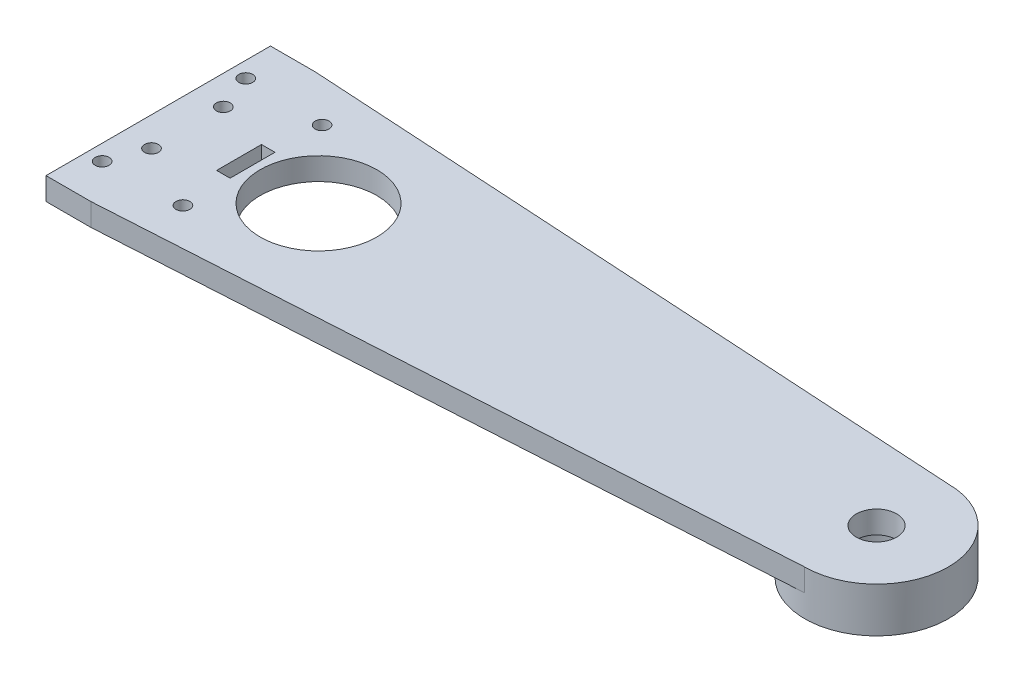
ISO-10303-21;
HEADER;
FILE_DESCRIPTION(('STEP AP214'),'2;1');
FILE_NAME('part.step','',(''),(''),'','','');
FILE_SCHEMA(('AUTOMOTIVE_DESIGN { 1 0 10303 214 1 1 1 1 }'));
ENDSEC;
DATA;
#1=APPLICATION_CONTEXT('core data for automotive mechanical design processes');
#2=APPLICATION_PROTOCOL_DEFINITION('international standard','automotive_design',2000,#1);
#3=PRODUCT_CONTEXT('',#1,'mechanical');
#4=PRODUCT('Part','Part','',(#3));
#5=PRODUCT_RELATED_PRODUCT_CATEGORY('part','',(#4));
#6=PRODUCT_DEFINITION_FORMATION('','',#4);
#7=PRODUCT_DEFINITION_CONTEXT('part definition',#1,'design');
#8=PRODUCT_DEFINITION('design','',#6,#7);
#9=PRODUCT_DEFINITION_SHAPE('','',#8);
#10=(LENGTH_UNIT() NAMED_UNIT(*) SI_UNIT(.MILLI.,.METRE.));
#11=(NAMED_UNIT(*) PLANE_ANGLE_UNIT() SI_UNIT($,.RADIAN.));
#12=(NAMED_UNIT(*) SI_UNIT($,.STERADIAN.) SOLID_ANGLE_UNIT());
#13=UNCERTAINTY_MEASURE_WITH_UNIT(LENGTH_MEASURE(1.E-05),#10,'distance_accuracy_value','');
#14=(GEOMETRIC_REPRESENTATION_CONTEXT(3) GLOBAL_UNCERTAINTY_ASSIGNED_CONTEXT((#13)) GLOBAL_UNIT_ASSIGNED_CONTEXT((#10,
#11,#12)) REPRESENTATION_CONTEXT('',''));
#15=CARTESIAN_POINT('',(0.,0.,0.));
#16=DIRECTION('',(0.,0.,1.));
#17=DIRECTION('',(1.,0.,0.));
#18=AXIS2_PLACEMENT_3D('',#15,#16,#17);
#19=CARTESIAN_POINT('',(113.,-5.,0.));
#20=DIRECTION('',(0.,-1.,0.));
#21=DIRECTION('',(0.,0.,-1.));
#22=AXIS2_PLACEMENT_3D('',#19,#20,#21);
#23=PLANE('',#22);
#24=CARTESIAN_POINT('',(113.,-5.,0.));
#25=DIRECTION('',(0.,-1.,0.));
#26=DIRECTION('',(0.,0.,-1.));
#27=AXIS2_PLACEMENT_3D('',#24,#25,#26);
#28=CIRCLE('',#27,4.5);
#29=CARTESIAN_POINT('',(113.,-5.,-4.5));
#30=VERTEX_POINT('',#29);
#31=EDGE_CURVE('E259',#30,#30,#28,.T.);
#32=ORIENTED_EDGE('',*,*,#31,.F.);
#33=EDGE_LOOP('',(#32));
#34=FACE_BOUND('',#33,.T.);
#35=CARTESIAN_POINT('',(113.,-5.,0.));
#36=DIRECTION('',(0.,-1.,0.));
#37=DIRECTION('',(0.,0.,-1.));
#38=AXIS2_PLACEMENT_3D('',#35,#36,#37);
#39=CIRCLE('',#38,8.2);
#40=CARTESIAN_POINT('',(113.,-5.,-8.2));
#41=VERTEX_POINT('',#40);
#42=EDGE_CURVE('E351',#41,#41,#39,.T.);
#43=ORIENTED_EDGE('',*,*,#42,.T.);
#44=EDGE_LOOP('',(#43));
#45=FACE_BOUND('',#44,.T.);
#46=ADVANCED_FACE('F39',(#34,#45),#23,.T.);
#47=CARTESIAN_POINT('',(113.,-5.,0.));
#48=DIRECTION('',(0.,-1.,0.));
#49=DIRECTION('',(0.,0.,-1.));
#50=AXIS2_PLACEMENT_3D('',#47,#48,#49);
#51=CIRCLE('',#50,16.);
#52=CARTESIAN_POINT('',(113.,-5.,16.));
#53=VERTEX_POINT('',#52);
#54=CARTESIAN_POINT('',(113.,-5.,-16.));
#55=VERTEX_POINT('',#54);
#56=EDGE_CURVE('E11',#53,#55,#51,.T.);
#57=ORIENTED_EDGE('',*,*,#56,.F.);
#58=DIRECTION('',(-0.998204845465779,0.,0.0598922907279467));
#59=VECTOR('',#58,1.);
#60=CARTESIAN_POINT('',(113.,-5.,16.));
#61=LINE('',#60,#59);
#62=CARTESIAN_POINT('',(-37.,-5.,25.));
#63=VERTEX_POINT('',#62);
#64=EDGE_CURVE('E137',#53,#63,#61,.T.);
#65=ORIENTED_EDGE('',*,*,#64,.T.);
#66=DIRECTION('',(-1.,0.,0.));
#67=VECTOR('',#66,1.);
#68=CARTESIAN_POINT('',(-47.,-5.,25.));
#69=LINE('',#68,#67);
#70=CARTESIAN_POINT('',(-47.,-5.,25.));
#71=VERTEX_POINT('',#70);
#72=EDGE_CURVE('E154',#63,#71,#69,.T.);
#73=ORIENTED_EDGE('',*,*,#72,.T.);
#74=DIRECTION('',(0.,0.,-1.));
#75=VECTOR('',#74,1.);
#76=CARTESIAN_POINT('',(-47.,-5.,-25.));
#77=LINE('',#76,#75);
#78=CARTESIAN_POINT('',(-47.,-5.,-25.));
#79=VERTEX_POINT('',#78);
#80=EDGE_CURVE('E157',#71,#79,#77,.T.);
#81=ORIENTED_EDGE('',*,*,#80,.T.);
#82=DIRECTION('',(1.,0.,0.));
#83=VECTOR('',#82,1.);
#84=CARTESIAN_POINT('',(-47.,-5.,-25.));
#85=LINE('',#84,#83);
#86=CARTESIAN_POINT('',(-37.,-5.,-25.));
#87=VERTEX_POINT('',#86);
#88=EDGE_CURVE('E134',#79,#87,#85,.T.);
#89=ORIENTED_EDGE('',*,*,#88,.T.);
#90=DIRECTION('',(0.998204845465779,0.,0.0598922907279467));
#91=VECTOR('',#90,1.);
#92=CARTESIAN_POINT('',(-37.,-5.,-25.));
#93=LINE('',#92,#91);
#94=EDGE_CURVE('E123',#87,#55,#93,.T.);
#95=ORIENTED_EDGE('',*,*,#94,.T.);
#96=EDGE_LOOP('',(#57,#65,#73,#81,#89,#95));
#97=FACE_BOUND('',#96,.T.);
#98=CARTESIAN_POINT('',(-26.,-5.,-15.5));
#99=DIRECTION('',(0.,-1.,0.));
#100=DIRECTION('',(0.,0.,-1.));
#101=AXIS2_PLACEMENT_3D('',#98,#99,#100);
#102=CIRCLE('',#101,1.55);
#103=CARTESIAN_POINT('',(-26.,-5.,-17.05));
#104=VERTEX_POINT('',#103);
#105=EDGE_CURVE('E320',#104,#104,#102,.T.);
#106=ORIENTED_EDGE('',*,*,#105,.F.);
#107=EDGE_LOOP('',(#106));
#108=FACE_BOUND('',#107,.T.);
#109=CARTESIAN_POINT('',(-43.5,-5.,16.));
#110=DIRECTION('',(0.,-1.,0.));
#111=DIRECTION('',(0.,0.,-1.));
#112=AXIS2_PLACEMENT_3D('',#109,#110,#111);
#113=CIRCLE('',#112,1.55);
#114=CARTESIAN_POINT('',(-43.5,-5.,14.45));
#115=VERTEX_POINT('',#114);
#116=EDGE_CURVE('E278',#115,#115,#113,.T.);
#117=ORIENTED_EDGE('',*,*,#116,.F.);
#118=EDGE_LOOP('',(#117));
#119=FACE_BOUND('',#118,.T.);
#120=CARTESIAN_POINT('',(-40.5,-5.,8.00000000000001));
#121=DIRECTION('',(0.,-1.,0.));
#122=DIRECTION('',(0.,0.,-1.));
#123=AXIS2_PLACEMENT_3D('',#120,#121,#122);
#124=CIRCLE('',#123,1.55);
#125=CARTESIAN_POINT('',(-40.5,-5.,6.45000000000001));
#126=VERTEX_POINT('',#125);
#127=EDGE_CURVE('E268',#126,#126,#124,.T.);
#128=ORIENTED_EDGE('',*,*,#127,.F.);
#129=EDGE_LOOP('',(#128));
#130=FACE_BOUND('',#129,.T.);
#131=CARTESIAN_POINT('',(-11.3,-5.,0.));
#132=DIRECTION('',(0.,-1.,0.));
#133=DIRECTION('',(0.,0.,-1.));
#134=AXIS2_PLACEMENT_3D('',#131,#132,#133);
#135=CIRCLE('',#134,13.);
#136=CARTESIAN_POINT('',(-11.3,-5.,-13.));
#137=VERTEX_POINT('',#136);
#138=EDGE_CURVE('E168',#137,#137,#135,.T.);
#139=ORIENTED_EDGE('',*,*,#138,.F.);
#140=EDGE_LOOP('',(#139));
#141=FACE_BOUND('',#140,.T.);
#142=CARTESIAN_POINT('',(-40.5,-5.,-7.99999999999999));
#143=DIRECTION('',(0.,-1.,0.));
#144=DIRECTION('',(0.,0.,-1.));
#145=AXIS2_PLACEMENT_3D('',#142,#143,#144);
#146=CIRCLE('',#145,1.55);
#147=CARTESIAN_POINT('',(-40.5,-5.,-9.54999999999999));
#148=VERTEX_POINT('',#147);
#149=EDGE_CURVE('E272',#148,#148,#146,.T.);
#150=ORIENTED_EDGE('',*,*,#149,.F.);
#151=EDGE_LOOP('',(#150));
#152=FACE_BOUND('',#151,.T.);
#153=CARTESIAN_POINT('',(-43.5,-5.,-16.));
#154=DIRECTION('',(0.,-1.,0.));
#155=DIRECTION('',(0.,0.,-1.));
#156=AXIS2_PLACEMENT_3D('',#153,#154,#155);
#157=CIRCLE('',#156,1.55);
#158=CARTESIAN_POINT('',(-43.5,-5.,-17.55));
#159=VERTEX_POINT('',#158);
#160=EDGE_CURVE('E284',#159,#159,#157,.T.);
#161=ORIENTED_EDGE('',*,*,#160,.F.);
#162=EDGE_LOOP('',(#161));
#163=FACE_BOUND('',#162,.T.);
#164=DIRECTION('',(0.,0.,-1.));
#165=VECTOR('',#164,1.);
#166=CARTESIAN_POINT('',(-29.,-5.,-5.));
#167=LINE('',#166,#165);
#168=CARTESIAN_POINT('',(-29.,-5.,5.));
#169=VERTEX_POINT('',#168);
#170=CARTESIAN_POINT('',(-29.,-5.,-5.));
#171=VERTEX_POINT('',#170);
#172=EDGE_CURVE('E326',#169,#171,#167,.T.);
#173=ORIENTED_EDGE('',*,*,#172,.F.);
#174=DIRECTION('',(-1.,0.,0.));
#175=VECTOR('',#174,1.);
#176=CARTESIAN_POINT('',(-29.,-5.,5.));
#177=LINE('',#176,#175);
#178=CARTESIAN_POINT('',(-26.,-5.,5.));
#179=VERTEX_POINT('',#178);
#180=EDGE_CURVE('E309',#179,#169,#177,.T.);
#181=ORIENTED_EDGE('',*,*,#180,.F.);
#182=DIRECTION('',(0.,0.,1.));
#183=VECTOR('',#182,1.);
#184=CARTESIAN_POINT('',(-26.,-5.,5.));
#185=LINE('',#184,#183);
#186=CARTESIAN_POINT('',(-26.,-5.,-5.));
#187=VERTEX_POINT('',#186);
#188=EDGE_CURVE('E304',#187,#179,#185,.T.);
#189=ORIENTED_EDGE('',*,*,#188,.F.);
#190=DIRECTION('',(1.,0.,0.));
#191=VECTOR('',#190,1.);
#192=CARTESIAN_POINT('',(-26.,-5.,-5.));
#193=LINE('',#192,#191);
#194=EDGE_CURVE('E323',#171,#187,#193,.T.);
#195=ORIENTED_EDGE('',*,*,#194,.F.);
#196=EDGE_LOOP('',(#173,#181,#189,#195));
#197=FACE_BOUND('',#196,.T.);
#198=CARTESIAN_POINT('',(-26.,-5.,15.5));
#199=DIRECTION('',(0.,-1.,0.));
#200=DIRECTION('',(0.,0.,-1.));
#201=AXIS2_PLACEMENT_3D('',#198,#199,#200);
#202=CIRCLE('',#201,1.55);
#203=CARTESIAN_POINT('',(-26.,-5.,13.95));
#204=VERTEX_POINT('',#203);
#205=EDGE_CURVE('E335',#204,#204,#202,.T.);
#206=ORIENTED_EDGE('',*,*,#205,.F.);
#207=EDGE_LOOP('',(#206));
#208=FACE_BOUND('',#207,.T.);
#209=ADVANCED_FACE('F130',(#97,#108,#119,#130,#141,#152,#163,#197,#208),#23,.T.);
#210=CARTESIAN_POINT('',(113.,0.,0.));
#211=DIRECTION('',(0.,-1.,0.));
#212=DIRECTION('',(0.,0.,-1.));
#213=AXIS2_PLACEMENT_3D('',#210,#211,#212);
#214=PLANE('',#213);
#215=CARTESIAN_POINT('',(-43.5,0.,-16.));
#216=DIRECTION('',(0.,-1.,0.));
#217=DIRECTION('',(0.,0.,-1.));
#218=AXIS2_PLACEMENT_3D('',#215,#216,#217);
#219=CIRCLE('',#218,1.55);
#220=CARTESIAN_POINT('',(-43.5,0.,-17.55));
#221=VERTEX_POINT('',#220);
#222=EDGE_CURVE('E237',#221,#221,#219,.T.);
#223=ORIENTED_EDGE('',*,*,#222,.T.);
#224=EDGE_LOOP('',(#223));
#225=FACE_BOUND('',#224,.T.);
#226=CARTESIAN_POINT('',(-43.5,0.,16.));
#227=DIRECTION('',(0.,-1.,0.));
#228=DIRECTION('',(0.,0.,-1.));
#229=AXIS2_PLACEMENT_3D('',#226,#227,#228);
#230=CIRCLE('',#229,1.55);
#231=CARTESIAN_POINT('',(-43.5,0.,14.45));
#232=VERTEX_POINT('',#231);
#233=EDGE_CURVE('E241',#232,#232,#230,.T.);
#234=ORIENTED_EDGE('',*,*,#233,.T.);
#235=EDGE_LOOP('',(#234));
#236=FACE_BOUND('',#235,.T.);
#237=CARTESIAN_POINT('',(-40.5,0.,-7.99999999999999));
#238=DIRECTION('',(0.,-1.,0.));
#239=DIRECTION('',(0.,0.,-1.));
#240=AXIS2_PLACEMENT_3D('',#237,#238,#239);
#241=CIRCLE('',#240,1.55);
#242=CARTESIAN_POINT('',(-40.5,0.,-9.54999999999999));
#243=VERTEX_POINT('',#242);
#244=EDGE_CURVE('E245',#243,#243,#241,.T.);
#245=ORIENTED_EDGE('',*,*,#244,.T.);
#246=EDGE_LOOP('',(#245));
#247=FACE_BOUND('',#246,.T.);
#248=CARTESIAN_POINT('',(-40.5,0.,8.00000000000001));
#249=DIRECTION('',(0.,-1.,0.));
#250=DIRECTION('',(0.,0.,-1.));
#251=AXIS2_PLACEMENT_3D('',#248,#249,#250);
#252=CIRCLE('',#251,1.55);
#253=CARTESIAN_POINT('',(-40.5,0.,6.45000000000001));
#254=VERTEX_POINT('',#253);
#255=EDGE_CURVE('E249',#254,#254,#252,.T.);
#256=ORIENTED_EDGE('',*,*,#255,.T.);
#257=EDGE_LOOP('',(#256));
#258=FACE_BOUND('',#257,.T.);
#259=CARTESIAN_POINT('',(113.,0.,0.));
#260=DIRECTION('',(0.,-1.,0.));
#261=DIRECTION('',(0.,0.,-1.));
#262=AXIS2_PLACEMENT_3D('',#259,#260,#261);
#263=CIRCLE('',#262,4.5);
#264=CARTESIAN_POINT('',(113.,0.,-4.5));
#265=VERTEX_POINT('',#264);
#266=EDGE_CURVE('E253',#265,#265,#263,.T.);
#267=ORIENTED_EDGE('',*,*,#266,.T.);
#268=EDGE_LOOP('',(#267));
#269=FACE_BOUND('',#268,.T.);
#270=CARTESIAN_POINT('',(-11.3,0.,0.));
#271=DIRECTION('',(0.,-1.,0.));
#272=DIRECTION('',(0.,0.,-1.));
#273=AXIS2_PLACEMENT_3D('',#270,#271,#272);
#274=CIRCLE('',#273,13.);
#275=CARTESIAN_POINT('',(-11.3,0.,-13.));
#276=VERTEX_POINT('',#275);
#277=EDGE_CURVE('E256',#276,#276,#274,.T.);
#278=ORIENTED_EDGE('',*,*,#277,.T.);
#279=EDGE_LOOP('',(#278));
#280=FACE_BOUND('',#279,.T.);
#281=DIRECTION('',(0.998204845465779,0.,0.0598922907279467));
#282=VECTOR('',#281,1.);
#283=CARTESIAN_POINT('',(-37.,0.,-25.));
#284=LINE('',#283,#282);
#285=CARTESIAN_POINT('',(-37.,0.,-25.));
#286=VERTEX_POINT('',#285);
#287=CARTESIAN_POINT('',(113.,0.,-16.));
#288=VERTEX_POINT('',#287);
#289=EDGE_CURVE('E125',#286,#288,#284,.T.);
#290=ORIENTED_EDGE('',*,*,#289,.F.);
#291=DIRECTION('',(1.,0.,0.));
#292=VECTOR('',#291,1.);
#293=CARTESIAN_POINT('',(-47.,0.,-25.));
#294=LINE('',#293,#292);
#295=CARTESIAN_POINT('',(-47.,0.,-25.));
#296=VERTEX_POINT('',#295);
#297=EDGE_CURVE('E138',#296,#286,#294,.T.);
#298=ORIENTED_EDGE('',*,*,#297,.F.);
#299=DIRECTION('',(0.,0.,-1.));
#300=VECTOR('',#299,1.);
#301=CARTESIAN_POINT('',(-47.,0.,-25.));
#302=LINE('',#301,#300);
#303=CARTESIAN_POINT('',(-47.,0.,25.));
#304=VERTEX_POINT('',#303);
#305=EDGE_CURVE('E177',#304,#296,#302,.T.);
#306=ORIENTED_EDGE('',*,*,#305,.F.);
#307=DIRECTION('',(-1.,0.,0.));
#308=VECTOR('',#307,1.);
#309=CARTESIAN_POINT('',(-47.,0.,25.));
#310=LINE('',#309,#308);
#311=CARTESIAN_POINT('',(-37.,0.,25.));
#312=VERTEX_POINT('',#311);
#313=EDGE_CURVE('E174',#312,#304,#310,.T.);
#314=ORIENTED_EDGE('',*,*,#313,.F.);
#315=DIRECTION('',(-0.998204845465779,0.,0.0598922907279467));
#316=VECTOR('',#315,1.);
#317=CARTESIAN_POINT('',(113.,0.,16.));
#318=LINE('',#317,#316);
#319=CARTESIAN_POINT('',(113.,0.,16.));
#320=VERTEX_POINT('',#319);
#321=EDGE_CURVE('E171',#320,#312,#318,.T.);
#322=ORIENTED_EDGE('',*,*,#321,.F.);
#323=CARTESIAN_POINT('',(113.,0.,0.));
#324=DIRECTION('',(0.,-1.,0.));
#325=DIRECTION('',(0.,0.,-1.));
#326=AXIS2_PLACEMENT_3D('',#323,#324,#325);
#327=CIRCLE('',#326,16.);
#328=EDGE_CURVE('E144',#288,#320,#327,.T.);
#329=ORIENTED_EDGE('',*,*,#328,.F.);
#330=EDGE_LOOP('',(#290,#298,#306,#314,#322,#329));
#331=FACE_BOUND('',#330,.T.);
#332=DIRECTION('',(-1.,0.,0.));
#333=VECTOR('',#332,1.);
#334=CARTESIAN_POINT('',(-29.,0.,5.));
#335=LINE('',#334,#333);
#336=CARTESIAN_POINT('',(-26.,0.,5.));
#337=VERTEX_POINT('',#336);
#338=CARTESIAN_POINT('',(-29.,0.,5.));
#339=VERTEX_POINT('',#338);
#340=EDGE_CURVE('E64',#337,#339,#335,.T.);
#341=ORIENTED_EDGE('',*,*,#340,.T.);
#342=DIRECTION('',(0.,0.,-1.));
#343=VECTOR('',#342,1.);
#344=CARTESIAN_POINT('',(-29.,0.,-5.));
#345=LINE('',#344,#343);
#346=CARTESIAN_POINT('',(-29.,0.,-5.));
#347=VERTEX_POINT('',#346);
#348=EDGE_CURVE('E314',#339,#347,#345,.T.);
#349=ORIENTED_EDGE('',*,*,#348,.T.);
#350=DIRECTION('',(1.,0.,0.));
#351=VECTOR('',#350,1.);
#352=CARTESIAN_POINT('',(-26.,0.,-5.));
#353=LINE('',#352,#351);
#354=CARTESIAN_POINT('',(-26.,0.,-5.));
#355=VERTEX_POINT('',#354);
#356=EDGE_CURVE('E310',#347,#355,#353,.T.);
#357=ORIENTED_EDGE('',*,*,#356,.T.);
#358=DIRECTION('',(0.,0.,1.));
#359=VECTOR('',#358,1.);
#360=CARTESIAN_POINT('',(-26.,0.,5.));
#361=LINE('',#360,#359);
#362=EDGE_CURVE('E305',#355,#337,#361,.T.);
#363=ORIENTED_EDGE('',*,*,#362,.T.);
#364=EDGE_LOOP('',(#341,#349,#357,#363));
#365=FACE_BOUND('',#364,.T.);
#366=CARTESIAN_POINT('',(-26.,0.,-15.5));
#367=DIRECTION('',(0.,-1.,0.));
#368=DIRECTION('',(0.,0.,-1.));
#369=AXIS2_PLACEMENT_3D('',#366,#367,#368);
#370=CIRCLE('',#369,1.55);
#371=CARTESIAN_POINT('',(-26.,0.,-17.05));
#372=VERTEX_POINT('',#371);
#373=EDGE_CURVE('E331',#372,#372,#370,.T.);
#374=ORIENTED_EDGE('',*,*,#373,.T.);
#375=EDGE_LOOP('',(#374));
#376=FACE_BOUND('',#375,.T.);
#377=CARTESIAN_POINT('',(-26.,0.,15.5));
#378=DIRECTION('',(0.,-1.,0.));
#379=DIRECTION('',(0.,0.,-1.));
#380=AXIS2_PLACEMENT_3D('',#377,#378,#379);
#381=CIRCLE('',#380,1.55);
#382=CARTESIAN_POINT('',(-26.,0.,13.95));
#383=VERTEX_POINT('',#382);
#384=EDGE_CURVE('E339',#383,#383,#381,.T.);
#385=ORIENTED_EDGE('',*,*,#384,.T.);
#386=EDGE_LOOP('',(#385));
#387=FACE_BOUND('',#386,.T.);
#388=ADVANCED_FACE('F199',(#225,#236,#247,#258,#269,#280,#331,#365,#376,#387),#214,.F.);
#389=CARTESIAN_POINT('',(-37.,-5.,-25.));
#390=DIRECTION('',(-0.0598922907279467,0.,0.998204845465779));
#391=DIRECTION('',(0.998204845465779,0.,0.0598922907279467));
#392=AXIS2_PLACEMENT_3D('',#389,#390,#391);
#393=PLANE('',#392);
#394=ORIENTED_EDGE('',*,*,#289,.T.);
#395=DIRECTION('',(0.,1.,0.));
#396=VECTOR('',#395,1.);
#397=CARTESIAN_POINT('',(113.,-5.,-16.));
#398=LINE('',#397,#396);
#399=EDGE_CURVE('E43',#55,#288,#398,.T.);
#400=ORIENTED_EDGE('',*,*,#399,.F.);
#401=ORIENTED_EDGE('',*,*,#94,.F.);
#402=DIRECTION('',(0.,1.,0.));
#403=VECTOR('',#402,1.);
#404=CARTESIAN_POINT('',(-37.,-5.,-25.));
#405=LINE('',#404,#403);
#406=EDGE_CURVE('E165',#87,#286,#405,.T.);
#407=ORIENTED_EDGE('',*,*,#406,.T.);
#408=EDGE_LOOP('',(#394,#400,#401,#407));
#409=FACE_BOUND('',#408,.T.);
#410=ADVANCED_FACE('F41',(#409),#393,.F.);
#411=CARTESIAN_POINT('',(113.,-5.,0.));
#412=DIRECTION('',(0.,1.,0.));
#413=DIRECTION('',(0.,0.,1.));
#414=AXIS2_PLACEMENT_3D('',#411,#412,#413);
#415=CYLINDRICAL_SURFACE('',#414,16.);
#416=ORIENTED_EDGE('',*,*,#328,.T.);
#417=DIRECTION('',(0.,1.,0.));
#418=VECTOR('',#417,1.);
#419=CARTESIAN_POINT('',(113.,-5.,16.));
#420=LINE('',#419,#418);
#421=EDGE_CURVE('E128',#53,#320,#420,.T.);
#422=ORIENTED_EDGE('',*,*,#421,.F.);
#423=ORIENTED_EDGE('',*,*,#56,.T.);
#424=ORIENTED_EDGE('',*,*,#399,.T.);
#425=EDGE_LOOP('',(#416,#422,#423,#424));
#426=FACE_BOUND('',#425,.T.);
#427=CARTESIAN_POINT('',(113.,-10.,0.));
#428=DIRECTION('',(0.,-1.,0.));
#429=DIRECTION('',(0.,0.,-1.));
#430=AXIS2_PLACEMENT_3D('',#427,#428,#429);
#431=CIRCLE('',#430,16.);
#432=CARTESIAN_POINT('',(113.,-10.,-16.));
#433=VERTEX_POINT('',#432);
#434=EDGE_CURVE('E343',#433,#433,#431,.T.);
#435=ORIENTED_EDGE('',*,*,#434,.F.);
#436=EDGE_LOOP('',(#435));
#437=FACE_BOUND('',#436,.T.);
#438=ADVANCED_FACE('F140',(#426,#437),#415,.T.);
#439=CARTESIAN_POINT('',(113.,-5.,16.));
#440=DIRECTION('',(-0.0598922907279467,0.,-0.998204845465779));
#441=DIRECTION('',(-0.998204845465779,0.,0.0598922907279467));
#442=AXIS2_PLACEMENT_3D('',#439,#440,#441);
#443=PLANE('',#442);
#444=ORIENTED_EDGE('',*,*,#321,.T.);
#445=DIRECTION('',(0.,1.,0.));
#446=VECTOR('',#445,1.);
#447=CARTESIAN_POINT('',(-37.,-5.,25.));
#448=LINE('',#447,#446);
#449=EDGE_CURVE('E148',#63,#312,#448,.T.);
#450=ORIENTED_EDGE('',*,*,#449,.F.);
#451=ORIENTED_EDGE('',*,*,#64,.F.);
#452=ORIENTED_EDGE('',*,*,#421,.T.);
#453=EDGE_LOOP('',(#444,#450,#451,#452));
#454=FACE_BOUND('',#453,.T.);
#455=ADVANCED_FACE('F150',(#454),#443,.F.);
#456=CARTESIAN_POINT('',(-47.,-5.,25.));
#457=DIRECTION('',(0.,0.,-1.));
#458=DIRECTION('',(-1.,0.,0.));
#459=AXIS2_PLACEMENT_3D('',#456,#457,#458);
#460=PLANE('',#459);
#461=ORIENTED_EDGE('',*,*,#313,.T.);
#462=DIRECTION('',(0.,1.,0.));
#463=VECTOR('',#462,1.);
#464=CARTESIAN_POINT('',(-47.,-5.,25.));
#465=LINE('',#464,#463);
#466=EDGE_CURVE('E188',#71,#304,#465,.T.);
#467=ORIENTED_EDGE('',*,*,#466,.F.);
#468=ORIENTED_EDGE('',*,*,#72,.F.);
#469=ORIENTED_EDGE('',*,*,#449,.T.);
#470=EDGE_LOOP('',(#461,#467,#468,#469));
#471=FACE_BOUND('',#470,.T.);
#472=ADVANCED_FACE('F195',(#471),#460,.F.);
#473=CARTESIAN_POINT('',(-47.,-5.,-25.));
#474=DIRECTION('',(1.,0.,0.));
#475=DIRECTION('',(0.,0.,-1.));
#476=AXIS2_PLACEMENT_3D('',#473,#474,#475);
#477=PLANE('',#476);
#478=ORIENTED_EDGE('',*,*,#305,.T.);
#479=DIRECTION('',(0.,1.,0.));
#480=VECTOR('',#479,1.);
#481=CARTESIAN_POINT('',(-47.,-5.,-25.));
#482=LINE('',#481,#480);
#483=EDGE_CURVE('E184',#79,#296,#482,.T.);
#484=ORIENTED_EDGE('',*,*,#483,.F.);
#485=ORIENTED_EDGE('',*,*,#80,.F.);
#486=ORIENTED_EDGE('',*,*,#466,.T.);
#487=EDGE_LOOP('',(#478,#484,#485,#486));
#488=FACE_BOUND('',#487,.T.);
#489=ADVANCED_FACE('F204',(#488),#477,.F.);
#490=CARTESIAN_POINT('',(-47.,-5.,-25.));
#491=DIRECTION('',(0.,0.,1.));
#492=DIRECTION('',(1.,0.,0.));
#493=AXIS2_PLACEMENT_3D('',#490,#491,#492);
#494=PLANE('',#493);
#495=ORIENTED_EDGE('',*,*,#297,.T.);
#496=ORIENTED_EDGE('',*,*,#406,.F.);
#497=ORIENTED_EDGE('',*,*,#88,.F.);
#498=ORIENTED_EDGE('',*,*,#483,.T.);
#499=EDGE_LOOP('',(#495,#496,#497,#498));
#500=FACE_BOUND('',#499,.T.);
#501=ADVANCED_FACE('F207',(#500),#494,.F.);
#502=CARTESIAN_POINT('',(-11.3,-5.,0.));
#503=DIRECTION('',(0.,1.,0.));
#504=DIRECTION('',(0.,0.,1.));
#505=AXIS2_PLACEMENT_3D('',#502,#503,#504);
#506=CYLINDRICAL_SURFACE('',#505,13.);
#507=ORIENTED_EDGE('',*,*,#138,.T.);
#508=EDGE_LOOP('',(#507));
#509=FACE_BOUND('',#508,.T.);
#510=ORIENTED_EDGE('',*,*,#277,.F.);
#511=EDGE_LOOP('',(#510));
#512=FACE_BOUND('',#511,.T.);
#513=ADVANCED_FACE('F209',(#509,#512),#506,.F.);
#514=CARTESIAN_POINT('',(113.,-5.,0.));
#515=DIRECTION('',(0.,1.,0.));
#516=DIRECTION('',(0.,0.,1.));
#517=AXIS2_PLACEMENT_3D('',#514,#515,#516);
#518=CYLINDRICAL_SURFACE('',#517,4.5);
#519=ORIENTED_EDGE('',*,*,#31,.T.);
#520=EDGE_LOOP('',(#519));
#521=FACE_BOUND('',#520,.T.);
#522=ORIENTED_EDGE('',*,*,#266,.F.);
#523=EDGE_LOOP('',(#522));
#524=FACE_BOUND('',#523,.T.);
#525=ADVANCED_FACE('F215',(#521,#524),#518,.F.);
#526=CARTESIAN_POINT('',(-40.5,-5.,8.00000000000001));
#527=DIRECTION('',(0.,1.,0.));
#528=DIRECTION('',(0.,0.,1.));
#529=AXIS2_PLACEMENT_3D('',#526,#527,#528);
#530=CYLINDRICAL_SURFACE('',#529,1.55);
#531=ORIENTED_EDGE('',*,*,#127,.T.);
#532=EDGE_LOOP('',(#531));
#533=FACE_BOUND('',#532,.T.);
#534=ORIENTED_EDGE('',*,*,#255,.F.);
#535=EDGE_LOOP('',(#534));
#536=FACE_BOUND('',#535,.T.);
#537=ADVANCED_FACE('F404',(#533,#536),#530,.F.);
#538=CARTESIAN_POINT('',(-40.5,-5.,-7.99999999999999));
#539=DIRECTION('',(0.,1.,0.));
#540=DIRECTION('',(0.,0.,1.));
#541=AXIS2_PLACEMENT_3D('',#538,#539,#540);
#542=CYLINDRICAL_SURFACE('',#541,1.55);
#543=ORIENTED_EDGE('',*,*,#149,.T.);
#544=EDGE_LOOP('',(#543));
#545=FACE_BOUND('',#544,.T.);
#546=ORIENTED_EDGE('',*,*,#244,.F.);
#547=EDGE_LOOP('',(#546));
#548=FACE_BOUND('',#547,.T.);
#549=ADVANCED_FACE('F400',(#545,#548),#542,.F.);
#550=CARTESIAN_POINT('',(-43.5,-5.,16.));
#551=DIRECTION('',(0.,1.,0.));
#552=DIRECTION('',(0.,0.,1.));
#553=AXIS2_PLACEMENT_3D('',#550,#551,#552);
#554=CYLINDRICAL_SURFACE('',#553,1.55);
#555=ORIENTED_EDGE('',*,*,#116,.T.);
#556=EDGE_LOOP('',(#555));
#557=FACE_BOUND('',#556,.T.);
#558=ORIENTED_EDGE('',*,*,#233,.F.);
#559=EDGE_LOOP('',(#558));
#560=FACE_BOUND('',#559,.T.);
#561=ADVANCED_FACE('F396',(#557,#560),#554,.F.);
#562=CARTESIAN_POINT('',(-43.5,-5.,-16.));
#563=DIRECTION('',(0.,1.,0.));
#564=DIRECTION('',(0.,0.,1.));
#565=AXIS2_PLACEMENT_3D('',#562,#563,#564);
#566=CYLINDRICAL_SURFACE('',#565,1.55);
#567=ORIENTED_EDGE('',*,*,#160,.T.);
#568=EDGE_LOOP('',(#567));
#569=FACE_BOUND('',#568,.T.);
#570=ORIENTED_EDGE('',*,*,#222,.F.);
#571=EDGE_LOOP('',(#570));
#572=FACE_BOUND('',#571,.T.);
#573=ADVANCED_FACE('F393',(#569,#572),#566,.F.);
#574=CARTESIAN_POINT('',(-29.,-5.,5.));
#575=DIRECTION('',(0.,0.,-1.));
#576=DIRECTION('',(-1.,0.,0.));
#577=AXIS2_PLACEMENT_3D('',#574,#575,#576);
#578=PLANE('',#577);
#579=ORIENTED_EDGE('',*,*,#340,.F.);
#580=DIRECTION('',(0.,1.,0.));
#581=VECTOR('',#580,1.);
#582=CARTESIAN_POINT('',(-26.,-5.,5.));
#583=LINE('',#582,#581);
#584=EDGE_CURVE('E301',#179,#337,#583,.T.);
#585=ORIENTED_EDGE('',*,*,#584,.F.);
#586=ORIENTED_EDGE('',*,*,#180,.T.);
#587=DIRECTION('',(0.,1.,0.));
#588=VECTOR('',#587,1.);
#589=CARTESIAN_POINT('',(-29.,-5.,5.));
#590=LINE('',#589,#588);
#591=EDGE_CURVE('E290',#169,#339,#590,.T.);
#592=ORIENTED_EDGE('',*,*,#591,.T.);
#593=EDGE_LOOP('',(#579,#585,#586,#592));
#594=FACE_BOUND('',#593,.T.);
#595=ADVANCED_FACE('F389',(#594),#578,.T.);
#596=CARTESIAN_POINT('',(-29.,-5.,-5.));
#597=DIRECTION('',(1.,0.,0.));
#598=DIRECTION('',(0.,0.,-1.));
#599=AXIS2_PLACEMENT_3D('',#596,#597,#598);
#600=PLANE('',#599);
#601=ORIENTED_EDGE('',*,*,#348,.F.);
#602=ORIENTED_EDGE('',*,*,#591,.F.);
#603=ORIENTED_EDGE('',*,*,#172,.T.);
#604=DIRECTION('',(0.,1.,0.));
#605=VECTOR('',#604,1.);
#606=CARTESIAN_POINT('',(-29.,-5.,-5.));
#607=LINE('',#606,#605);
#608=EDGE_CURVE('E296',#171,#347,#607,.T.);
#609=ORIENTED_EDGE('',*,*,#608,.T.);
#610=EDGE_LOOP('',(#601,#602,#603,#609));
#611=FACE_BOUND('',#610,.T.);
#612=ADVANCED_FACE('F385',(#611),#600,.T.);
#613=CARTESIAN_POINT('',(-26.,-5.,-5.));
#614=DIRECTION('',(0.,0.,1.));
#615=DIRECTION('',(1.,0.,0.));
#616=AXIS2_PLACEMENT_3D('',#613,#614,#615);
#617=PLANE('',#616);
#618=ORIENTED_EDGE('',*,*,#356,.F.);
#619=ORIENTED_EDGE('',*,*,#608,.F.);
#620=ORIENTED_EDGE('',*,*,#194,.T.);
#621=DIRECTION('',(0.,1.,0.));
#622=VECTOR('',#621,1.);
#623=CARTESIAN_POINT('',(-26.,-5.,-5.));
#624=LINE('',#623,#622);
#625=EDGE_CURVE('E56',#187,#355,#624,.T.);
#626=ORIENTED_EDGE('',*,*,#625,.T.);
#627=EDGE_LOOP('',(#618,#619,#620,#626));
#628=FACE_BOUND('',#627,.T.);
#629=ADVANCED_FACE('F382',(#628),#617,.T.);
#630=CARTESIAN_POINT('',(-26.,-5.,5.));
#631=DIRECTION('',(-1.,0.,0.));
#632=DIRECTION('',(0.,0.,1.));
#633=AXIS2_PLACEMENT_3D('',#630,#631,#632);
#634=PLANE('',#633);
#635=ORIENTED_EDGE('',*,*,#362,.F.);
#636=ORIENTED_EDGE('',*,*,#625,.F.);
#637=ORIENTED_EDGE('',*,*,#188,.T.);
#638=ORIENTED_EDGE('',*,*,#584,.T.);
#639=EDGE_LOOP('',(#635,#636,#637,#638));
#640=FACE_BOUND('',#639,.T.);
#641=ADVANCED_FACE('F378',(#640),#634,.T.);
#642=CARTESIAN_POINT('',(-26.,-5.,-15.5));
#643=DIRECTION('',(0.,1.,0.));
#644=DIRECTION('',(0.,0.,1.));
#645=AXIS2_PLACEMENT_3D('',#642,#643,#644);
#646=CYLINDRICAL_SURFACE('',#645,1.55);
#647=ORIENTED_EDGE('',*,*,#105,.T.);
#648=EDGE_LOOP('',(#647));
#649=FACE_BOUND('',#648,.T.);
#650=ORIENTED_EDGE('',*,*,#373,.F.);
#651=EDGE_LOOP('',(#650));
#652=FACE_BOUND('',#651,.T.);
#653=ADVANCED_FACE('F372',(#649,#652),#646,.F.);
#654=CARTESIAN_POINT('',(-26.,-5.,15.5));
#655=DIRECTION('',(0.,1.,0.));
#656=DIRECTION('',(0.,0.,1.));
#657=AXIS2_PLACEMENT_3D('',#654,#655,#656);
#658=CYLINDRICAL_SURFACE('',#657,1.55);
#659=ORIENTED_EDGE('',*,*,#205,.T.);
#660=EDGE_LOOP('',(#659));
#661=FACE_BOUND('',#660,.T.);
#662=ORIENTED_EDGE('',*,*,#384,.F.);
#663=EDGE_LOOP('',(#662));
#664=FACE_BOUND('',#663,.T.);
#665=ADVANCED_FACE('F364',(#661,#664),#658,.F.);
#666=CARTESIAN_POINT('',(113.,-10.,0.));
#667=DIRECTION('',(0.,-1.,0.));
#668=DIRECTION('',(0.,0.,-1.));
#669=AXIS2_PLACEMENT_3D('',#666,#667,#668);
#670=PLANE('',#669);
#671=ORIENTED_EDGE('',*,*,#434,.T.);
#672=EDGE_LOOP('',(#671));
#673=FACE_BOUND('',#672,.T.);
#674=CARTESIAN_POINT('',(113.,-10.,0.));
#675=DIRECTION('',(0.,-1.,0.));
#676=DIRECTION('',(0.,0.,-1.));
#677=AXIS2_PLACEMENT_3D('',#674,#675,#676);
#678=CIRCLE('',#677,8.2);
#679=CARTESIAN_POINT('',(113.,-10.,-8.2));
#680=VERTEX_POINT('',#679);
#681=EDGE_CURVE('E350',#680,#680,#678,.T.);
#682=ORIENTED_EDGE('',*,*,#681,.F.);
#683=EDGE_LOOP('',(#682));
#684=FACE_BOUND('',#683,.T.);
#685=ADVANCED_FACE('F362',(#673,#684),#670,.T.);
#686=CARTESIAN_POINT('',(113.,-10.,0.));
#687=DIRECTION('',(0.,1.,0.));
#688=DIRECTION('',(0.,0.,1.));
#689=AXIS2_PLACEMENT_3D('',#686,#687,#688);
#690=CYLINDRICAL_SURFACE('',#689,8.2);
#691=ORIENTED_EDGE('',*,*,#681,.T.);
#692=EDGE_LOOP('',(#691));
#693=FACE_BOUND('',#692,.T.);
#694=ORIENTED_EDGE('',*,*,#42,.F.);
#695=EDGE_LOOP('',(#694));
#696=FACE_BOUND('',#695,.T.);
#697=ADVANCED_FACE('F359',(#693,#696),#690,.F.);
#698=CLOSED_SHELL('',(#46,#209,#388,#410,#438,#455,#472,#489,#501,#513,#525,#537,#549,#561,#573,
#595,#612,#629,#641,#653,#665,#685,#697));
#699=MANIFOLD_SOLID_BREP('B2',#698);
#700=ADVANCED_BREP_SHAPE_REPRESENTATION('',(#18,#699),#14);
#701=SHAPE_DEFINITION_REPRESENTATION(#9,#700);
ENDSEC;
END-ISO-10303-21;
